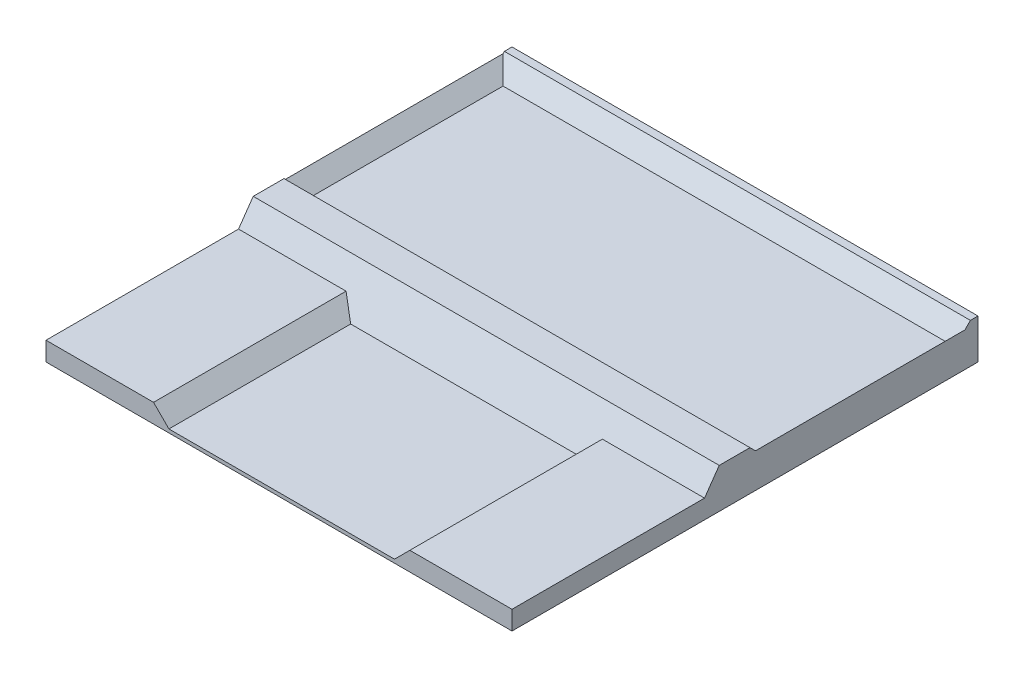
ISO-10303-21;
HEADER;
FILE_DESCRIPTION(('STEP AP214'),'2;1');
FILE_NAME('part.step','',(''),(''),'','','');
FILE_SCHEMA(('AUTOMOTIVE_DESIGN { 1 0 10303 214 1 1 1 1 }'));
ENDSEC;
DATA;
#1=APPLICATION_CONTEXT('core data for automotive mechanical design processes');
#2=APPLICATION_PROTOCOL_DEFINITION('international standard','automotive_design',2000,#1);
#3=PRODUCT_CONTEXT('',#1,'mechanical');
#4=PRODUCT('Part','Part','',(#3));
#5=PRODUCT_RELATED_PRODUCT_CATEGORY('part','',(#4));
#6=PRODUCT_DEFINITION_FORMATION('','',#4);
#7=PRODUCT_DEFINITION_CONTEXT('part definition',#1,'design');
#8=PRODUCT_DEFINITION('design','',#6,#7);
#9=PRODUCT_DEFINITION_SHAPE('','',#8);
#10=(LENGTH_UNIT() NAMED_UNIT(*) SI_UNIT(.MILLI.,.METRE.));
#11=(NAMED_UNIT(*) PLANE_ANGLE_UNIT() SI_UNIT($,.RADIAN.));
#12=(NAMED_UNIT(*) SI_UNIT($,.STERADIAN.) SOLID_ANGLE_UNIT());
#13=UNCERTAINTY_MEASURE_WITH_UNIT(LENGTH_MEASURE(1.E-05),#10,'distance_accuracy_value','');
#14=(GEOMETRIC_REPRESENTATION_CONTEXT(3) GLOBAL_UNCERTAINTY_ASSIGNED_CONTEXT((#13)) GLOBAL_UNIT_ASSIGNED_CONTEXT((#10,
#11,#12)) REPRESENTATION_CONTEXT('',''));
#15=CARTESIAN_POINT('',(0.,0.,0.));
#16=DIRECTION('',(0.,0.,1.));
#17=DIRECTION('',(1.,0.,0.));
#18=AXIS2_PLACEMENT_3D('',#15,#16,#17);
#19=CARTESIAN_POINT('',(90.,0.,0.));
#20=DIRECTION('',(1.,0.,0.));
#21=DIRECTION('',(0.,0.,-1.));
#22=AXIS2_PLACEMENT_3D('',#19,#20,#21);
#23=PLANE('',#22);
#24=DIRECTION('',(0.,0.,1.));
#25=VECTOR('',#24,1.);
#26=CARTESIAN_POINT('',(90.,73.2813818702787,48.078086111532));
#27=LINE('',#26,#25);
#28=CARTESIAN_POINT('',(90.,73.2813818702787,-34.9391813018675));
#29=VERTEX_POINT('',#28);
#30=CARTESIAN_POINT('',(90.,73.2813818702787,45.9553535249315));
#31=VERTEX_POINT('',#30);
#32=EDGE_CURVE('E278',#29,#31,#27,.T.);
#33=ORIENTED_EDGE('',*,*,#32,.T.);
#34=DIRECTION('',(0.,0.707106781186548,0.707106781186548));
#35=VECTOR('',#34,1.);
#36=CARTESIAN_POINT('',(90.,75.4041144568792,48.078086111532));
#37=LINE('',#36,#35);
#38=CARTESIAN_POINT('',(90.,75.4041144568792,48.078086111532));
#39=VERTEX_POINT('',#38);
#40=EDGE_CURVE('E276',#31,#39,#37,.T.);
#41=ORIENTED_EDGE('',*,*,#40,.T.);
#42=DIRECTION('',(0.,0.,1.));
#43=VECTOR('',#42,1.);
#44=CARTESIAN_POINT('',(90.,75.4041144568792,59.958086111532));
#45=LINE('',#44,#43);
#46=CARTESIAN_POINT('',(90.,75.4041144568792,59.958086111532));
#47=VERTEX_POINT('',#46);
#48=EDGE_CURVE('E283',#39,#47,#45,.T.);
#49=ORIENTED_EDGE('',*,*,#48,.T.);
#50=DIRECTION('',(0.,-0.819152044288993,0.573576436351045));
#51=VECTOR('',#50,1.);
#52=CARTESIAN_POINT('',(90.,67.2945092184182,65.6364928314073));
#53=LINE('',#52,#51);
#54=CARTESIAN_POINT('',(90.,67.2945092184182,65.6364928314073));
#55=VERTEX_POINT('',#54);
#56=EDGE_CURVE('E285',#47,#55,#53,.T.);
#57=ORIENTED_EDGE('',*,*,#56,.T.);
#58=DIRECTION('',(0.,0.,1.));
#59=VECTOR('',#58,1.);
#60=CARTESIAN_POINT('',(90.,67.2945092184182,144.836492831407));
#61=LINE('',#60,#59);
#62=CARTESIAN_POINT('',(90.,67.2945092184182,140.));
#63=VERTEX_POINT('',#62);
#64=EDGE_CURVE('E78',#55,#63,#61,.T.);
#65=ORIENTED_EDGE('',*,*,#64,.T.);
#66=DIRECTION('',(0.,1.,0.));
#67=VECTOR('',#66,1.);
#68=CARTESIAN_POINT('',(90.,0.,140.));
#69=LINE('',#68,#67);
#70=CARTESIAN_POINT('',(90.,59.9999999998261,140.));
#71=VERTEX_POINT('',#70);
#72=EDGE_CURVE('E15',#71,#63,#69,.T.);
#73=ORIENTED_EDGE('',*,*,#72,.F.);
#74=DIRECTION('',(0.,0.,-1.));
#75=VECTOR('',#74,1.);
#76=CARTESIAN_POINT('',(90.,60.,0.));
#77=LINE('',#76,#75);
#78=CARTESIAN_POINT('',(90.,60.,-40.));
#79=VERTEX_POINT('',#78);
#80=EDGE_CURVE('E174',#71,#79,#77,.T.);
#81=ORIENTED_EDGE('',*,*,#80,.T.);
#82=DIRECTION('',(0.,1.,0.));
#83=VECTOR('',#82,1.);
#84=CARTESIAN_POINT('',(90.,0.,-40.));
#85=LINE('',#84,#83);
#86=CARTESIAN_POINT('',(90.,75.4041144568792,-40.));
#87=VERTEX_POINT('',#86);
#88=EDGE_CURVE('E287',#79,#87,#85,.T.);
#89=ORIENTED_EDGE('',*,*,#88,.T.);
#90=CARTESIAN_POINT('',(90.,75.4041144568792,-37.061913888468));
#91=VERTEX_POINT('',#90);
#92=EDGE_CURVE('E282',#87,#91,#45,.T.);
#93=ORIENTED_EDGE('',*,*,#92,.T.);
#94=DIRECTION('',(0.,-0.707106781186548,0.707106781186547));
#95=VECTOR('',#94,1.);
#96=CARTESIAN_POINT('',(90.,75.4041144568792,-37.061913888468));
#97=LINE('',#96,#95);
#98=EDGE_CURVE('E280',#91,#29,#97,.T.);
#99=ORIENTED_EDGE('',*,*,#98,.T.);
#100=EDGE_LOOP('',(#33,#41,#49,#57,#65,#73,#81,#89,#93,#99));
#101=FACE_BOUND('',#100,.T.);
#102=ADVANCED_FACE('F63',(#101),#23,.T.);
#103=CARTESIAN_POINT('',(100.042732586601,67.2945092184182,144.836492831407));
#104=DIRECTION('',(0.,-1.,0.));
#105=DIRECTION('',(0.,0.,-1.));
#106=AXIS2_PLACEMENT_3D('',#103,#104,#105);
#107=PLANE('',#106);
#108=ORIENTED_EDGE('',*,*,#64,.F.);
#109=DIRECTION('',(-1.,0.,0.));
#110=VECTOR('',#109,1.);
#111=CARTESIAN_POINT('',(100.042732586601,67.2945092184182,65.6364928314073));
#112=LINE('',#111,#110);
#113=CARTESIAN_POINT('',(50.5427325866005,67.2945092184182,65.6364928314073));
#114=VERTEX_POINT('',#113);
#115=EDGE_CURVE('E225',#55,#114,#112,.T.);
#116=ORIENTED_EDGE('',*,*,#115,.T.);
#117=DIRECTION('',(0.,0.,1.));
#118=VECTOR('',#117,1.);
#119=CARTESIAN_POINT('',(50.5427325866005,67.2945092184182,65.6364928314073));
#120=LINE('',#119,#118);
#121=CARTESIAN_POINT('',(50.5427325866005,67.2945092184182,140.));
#122=VERTEX_POINT('',#121);
#123=EDGE_CURVE('E232',#114,#122,#120,.T.);
#124=ORIENTED_EDGE('',*,*,#123,.T.);
#125=DIRECTION('',(-1.,0.,0.));
#126=VECTOR('',#125,1.);
#127=CARTESIAN_POINT('',(100.042732586601,67.2945092184182,140.));
#128=LINE('',#127,#126);
#129=EDGE_CURVE('E253',#63,#122,#128,.T.);
#130=ORIENTED_EDGE('',*,*,#129,.F.);
#131=EDGE_LOOP('',(#108,#116,#124,#130));
#132=FACE_BOUND('',#131,.T.);
#133=ADVANCED_FACE('F350',(#132),#107,.F.);
#134=CARTESIAN_POINT('',(0.,60.,0.));
#135=DIRECTION('',(0.,1.,0.));
#136=DIRECTION('',(0.,0.,1.));
#137=AXIS2_PLACEMENT_3D('',#134,#135,#136);
#138=PLANE('',#137);
#139=ORIENTED_EDGE('',*,*,#80,.F.);
#140=DIRECTION('',(1.,0.,0.));
#141=VECTOR('',#140,1.);
#142=CARTESIAN_POINT('',(0.,60.,140.));
#143=LINE('',#142,#141);
#144=CARTESIAN_POINT('',(-90.,60.,140.));
#145=VERTEX_POINT('',#144);
#146=EDGE_CURVE('E183',#145,#71,#143,.T.);
#147=ORIENTED_EDGE('',*,*,#146,.F.);
#148=DIRECTION('',(0.,0.,-1.));
#149=VECTOR('',#148,1.);
#150=CARTESIAN_POINT('',(-90.,60.,0.));
#151=LINE('',#150,#149);
#152=CARTESIAN_POINT('',(-90.,60.,-40.));
#153=VERTEX_POINT('',#152);
#154=EDGE_CURVE('E274',#145,#153,#151,.T.);
#155=ORIENTED_EDGE('',*,*,#154,.T.);
#156=DIRECTION('',(1.,0.,0.));
#157=VECTOR('',#156,1.);
#158=CARTESIAN_POINT('',(0.,60.,-40.));
#159=LINE('',#158,#157);
#160=EDGE_CURVE('E186',#153,#79,#159,.T.);
#161=ORIENTED_EDGE('',*,*,#160,.T.);
#162=EDGE_LOOP('',(#139,#147,#155,#161));
#163=FACE_BOUND('',#162,.T.);
#164=ADVANCED_FACE('F182',(#163),#138,.F.);
#165=CARTESIAN_POINT('',(92.1227325866005,75.4041144568792,48.078086111532));
#166=DIRECTION('',(0.,-0.707106781186547,0.707106781186547));
#167=DIRECTION('',(-1.,0.,0.));
#168=AXIS2_PLACEMENT_3D('',#165,#166,#167);
#169=PLANE('',#168);
#170=ORIENTED_EDGE('',*,*,#40,.F.);
#171=DIRECTION('',(-0.577350269189626,-0.577350269189626,-0.577350269189626));
#172=VECTOR('',#171,1.);
#173=CARTESIAN_POINT('',(92.1227325866005,75.4041144568792,48.078086111532));
#174=LINE('',#173,#172);
#175=CARTESIAN_POINT('',(86.1827325866005,69.4641144568792,42.138086111532));
#176=VERTEX_POINT('',#175);
#177=EDGE_CURVE('E197',#31,#176,#174,.T.);
#178=ORIENTED_EDGE('',*,*,#177,.T.);
#179=DIRECTION('',(1.,0.,0.));
#180=VECTOR('',#179,1.);
#181=CARTESIAN_POINT('',(1.04273258660053,69.4641144568792,42.138086111532));
#182=LINE('',#181,#180);
#183=CARTESIAN_POINT('',(-84.5800351928598,69.4641144568792,42.138086111532));
#184=VERTEX_POINT('',#183);
#185=EDGE_CURVE('E207',#184,#176,#182,.T.);
#186=ORIENTED_EDGE('',*,*,#185,.F.);
#187=DIRECTION('',(0.577350269189626,-0.577350269189626,-0.577350269189626));
#188=VECTOR('',#187,1.);
#189=CARTESIAN_POINT('',(-29.6391125997064,14.5231918637258,-12.8028364816214));
#190=LINE('',#189,#188);
#191=CARTESIAN_POINT('',(-90.,74.8840792640194,47.5580509186722));
#192=VERTEX_POINT('',#191);
#193=EDGE_CURVE('E195',#192,#184,#190,.T.);
#194=ORIENTED_EDGE('',*,*,#193,.F.);
#195=DIRECTION('',(0.,0.707106781186548,0.707106781186548));
#196=VECTOR('',#195,1.);
#197=CARTESIAN_POINT('',(-90.,75.4041144568792,48.078086111532));
#198=LINE('',#197,#196);
#199=CARTESIAN_POINT('',(-90.,75.4041144568792,48.078086111532));
#200=VERTEX_POINT('',#199);
#201=EDGE_CURVE('E258',#192,#200,#198,.T.);
#202=ORIENTED_EDGE('',*,*,#201,.T.);
#203=DIRECTION('',(1.,0.,0.));
#204=VECTOR('',#203,1.);
#205=CARTESIAN_POINT('',(92.1227325866005,75.4041144568792,48.078086111532));
#206=LINE('',#205,#204);
#207=EDGE_CURVE('E239',#200,#39,#206,.T.);
#208=ORIENTED_EDGE('',*,*,#207,.T.);
#209=EDGE_LOOP('',(#170,#178,#186,#194,#202,#208));
#210=FACE_BOUND('',#209,.T.);
#211=ADVANCED_FACE('F320',(#210),#169,.F.);
#212=CARTESIAN_POINT('',(92.1227325866005,75.4041144568792,48.078086111532));
#213=DIRECTION('',(0.707106781186548,-0.707106781186547,0.));
#214=DIRECTION('',(0.,0.,1.));
#215=AXIS2_PLACEMENT_3D('',#212,#213,#214);
#216=PLANE('',#215);
#217=ORIENTED_EDGE('',*,*,#32,.F.);
#218=DIRECTION('',(-0.577350269189626,-0.577350269189626,0.577350269189626));
#219=VECTOR('',#218,1.);
#220=CARTESIAN_POINT('',(92.1227325866005,75.4041144568792,-37.061913888468));
#221=LINE('',#220,#219);
#222=CARTESIAN_POINT('',(86.1827325866005,69.4641144568792,-31.121913888468));
#223=VERTEX_POINT('',#222);
#224=EDGE_CURVE('E199',#29,#223,#221,.T.);
#225=ORIENTED_EDGE('',*,*,#224,.T.);
#226=DIRECTION('',(0.,0.,-1.));
#227=VECTOR('',#226,1.);
#228=CARTESIAN_POINT('',(86.1827325866005,69.4641144568792,-54.6203206083434));
#229=LINE('',#228,#227);
#230=EDGE_CURVE('E204',#176,#223,#229,.T.);
#231=ORIENTED_EDGE('',*,*,#230,.F.);
#232=ORIENTED_EDGE('',*,*,#177,.F.);
#233=EDGE_LOOP('',(#217,#225,#231,#232));
#234=FACE_BOUND('',#233,.T.);
#235=ADVANCED_FACE('F315',(#234),#216,.F.);
#236=CARTESIAN_POINT('',(92.1227325866005,75.4041144568792,-37.061913888468));
#237=DIRECTION('',(0.,-0.707106781186547,-0.707106781186548));
#238=DIRECTION('',(1.,0.,0.));
#239=AXIS2_PLACEMENT_3D('',#236,#237,#238);
#240=PLANE('',#239);
#241=ORIENTED_EDGE('',*,*,#98,.F.);
#242=DIRECTION('',(-1.,0.,0.));
#243=VECTOR('',#242,1.);
#244=CARTESIAN_POINT('',(92.1227325866005,75.4041144568792,-37.061913888468));
#245=LINE('',#244,#243);
#246=CARTESIAN_POINT('',(-90.,75.4041144568792,-37.061913888468));
#247=VERTEX_POINT('',#246);
#248=EDGE_CURVE('E235',#91,#247,#245,.T.);
#249=ORIENTED_EDGE('',*,*,#248,.T.);
#250=DIRECTION('',(0.,-0.707106781186548,0.707106781186547));
#251=VECTOR('',#250,1.);
#252=CARTESIAN_POINT('',(-90.,75.4041144568792,-37.061913888468));
#253=LINE('',#252,#251);
#254=CARTESIAN_POINT('',(-90.,74.8840792640194,-36.5418786956082));
#255=VERTEX_POINT('',#254);
#256=EDGE_CURVE('E260',#247,#255,#253,.T.);
#257=ORIENTED_EDGE('',*,*,#256,.T.);
#258=DIRECTION('',(0.577350269189626,-0.577350269189626,0.577350269189625));
#259=VECTOR('',#258,1.);
#260=CARTESIAN_POINT('',(-62.1400351928598,47.0241144568792,-8.68191388846802));
#261=LINE('',#260,#259);
#262=CARTESIAN_POINT('',(-84.5800351928598,69.4641144568792,-31.121913888468));
#263=VERTEX_POINT('',#262);
#264=EDGE_CURVE('E191',#255,#263,#261,.T.);
#265=ORIENTED_EDGE('',*,*,#264,.T.);
#266=DIRECTION('',(-1.,0.,0.));
#267=VECTOR('',#266,1.);
#268=CARTESIAN_POINT('',(1.04273258660052,69.4641144568792,-31.121913888468));
#269=LINE('',#268,#267);
#270=EDGE_CURVE('E201',#223,#263,#269,.T.);
#271=ORIENTED_EDGE('',*,*,#270,.F.);
#272=ORIENTED_EDGE('',*,*,#224,.F.);
#273=EDGE_LOOP('',(#241,#249,#257,#265,#271,#272));
#274=FACE_BOUND('',#273,.T.);
#275=ADVANCED_FACE('F305',(#274),#240,.F.);
#276=CARTESIAN_POINT('',(100.042732586601,75.4041144568792,59.958086111532));
#277=DIRECTION('',(0.,-1.,0.));
#278=DIRECTION('',(0.,0.,-1.));
#279=AXIS2_PLACEMENT_3D('',#276,#277,#278);
#280=PLANE('',#279);
#281=ORIENTED_EDGE('',*,*,#92,.F.);
#282=DIRECTION('',(-1.,0.,0.));
#283=VECTOR('',#282,1.);
#284=CARTESIAN_POINT('',(100.042732586601,75.4041144568792,-40.));
#285=LINE('',#284,#283);
#286=CARTESIAN_POINT('',(-90.,75.4041144568792,-40.));
#287=VERTEX_POINT('',#286);
#288=EDGE_CURVE('E242',#87,#287,#285,.T.);
#289=ORIENTED_EDGE('',*,*,#288,.T.);
#290=DIRECTION('',(0.,0.,1.));
#291=VECTOR('',#290,1.);
#292=CARTESIAN_POINT('',(-90.,75.4041144568792,59.958086111532));
#293=LINE('',#292,#291);
#294=EDGE_CURVE('E262',#287,#247,#293,.T.);
#295=ORIENTED_EDGE('',*,*,#294,.T.);
#296=ORIENTED_EDGE('',*,*,#248,.F.);
#297=EDGE_LOOP('',(#281,#289,#295,#296));
#298=FACE_BOUND('',#297,.T.);
#299=ADVANCED_FACE('F295',(#298),#280,.F.);
#300=ORIENTED_EDGE('',*,*,#48,.F.);
#301=ORIENTED_EDGE('',*,*,#207,.F.);
#302=CARTESIAN_POINT('',(-90.,75.4041144568792,59.958086111532));
#303=VERTEX_POINT('',#302);
#304=EDGE_CURVE('E263',#200,#303,#293,.T.);
#305=ORIENTED_EDGE('',*,*,#304,.T.);
#306=DIRECTION('',(-1.,0.,0.));
#307=VECTOR('',#306,1.);
#308=CARTESIAN_POINT('',(100.042732586601,75.4041144568792,59.958086111532));
#309=LINE('',#308,#307);
#310=EDGE_CURVE('E223',#47,#303,#309,.T.);
#311=ORIENTED_EDGE('',*,*,#310,.F.);
#312=EDGE_LOOP('',(#300,#301,#305,#311));
#313=FACE_BOUND('',#312,.T.);
#314=ADVANCED_FACE('F324',(#313),#280,.F.);
#315=CARTESIAN_POINT('',(100.042732586601,67.2945092184182,65.6364928314073));
#316=DIRECTION('',(0.,-0.573576436351045,-0.819152044288993));
#317=DIRECTION('',(0.,0.819152044288993,-0.573576436351045));
#318=AXIS2_PLACEMENT_3D('',#315,#316,#317);
#319=PLANE('',#318);
#320=ORIENTED_EDGE('',*,*,#56,.F.);
#321=ORIENTED_EDGE('',*,*,#310,.T.);
#322=DIRECTION('',(0.,-0.819152044288993,0.573576436351045));
#323=VECTOR('',#322,1.);
#324=CARTESIAN_POINT('',(-90.,67.2945092184182,65.6364928314073));
#325=LINE('',#324,#323);
#326=CARTESIAN_POINT('',(-90.,67.2945092184182,65.6364928314073));
#327=VERTEX_POINT('',#326);
#328=EDGE_CURVE('E266',#303,#327,#325,.T.);
#329=ORIENTED_EDGE('',*,*,#328,.T.);
#330=CARTESIAN_POINT('',(-48.4572674133995,67.2945092184182,65.6364928314073));
#331=VERTEX_POINT('',#330);
#332=EDGE_CURVE('E227',#331,#327,#112,.T.);
#333=ORIENTED_EDGE('',*,*,#332,.F.);
#334=DIRECTION('',(-0.633687274224642,0.633687274224643,-0.443712606279657));
#335=VECTOR('',#334,1.);
#336=CARTESIAN_POINT('',(-82.2704807820387,101.107722587057,41.9602259395928));
#337=LINE('',#336,#335);
#338=CARTESIAN_POINT('',(-42.5172674133995,61.3545092184182,69.795725608373));
#339=VERTEX_POINT('',#338);
#340=EDGE_CURVE('E218',#331,#339,#337,.F.);
#341=ORIENTED_EDGE('',*,*,#340,.T.);
#342=DIRECTION('',(1.,0.,0.));
#343=VECTOR('',#342,1.);
#344=CARTESIAN_POINT('',(-48.4572674133995,61.3545092184182,69.795725608373));
#345=LINE('',#344,#343);
#346=CARTESIAN_POINT('',(44.6027325866005,61.3545092184182,69.795725608373));
#347=VERTEX_POINT('',#346);
#348=EDGE_CURVE('E228',#339,#347,#345,.T.);
#349=ORIENTED_EDGE('',*,*,#348,.T.);
#350=DIRECTION('',(0.633687274224642,0.633687274224643,-0.443712606279657));
#351=VECTOR('',#350,1.);
#352=CARTESIAN_POINT('',(84.3559459552398,101.107722587058,41.9602259395928));
#353=LINE('',#352,#351);
#354=EDGE_CURVE('E213',#347,#114,#353,.T.);
#355=ORIENTED_EDGE('',*,*,#354,.T.);
#356=ORIENTED_EDGE('',*,*,#115,.F.);
#357=EDGE_LOOP('',(#320,#321,#329,#333,#341,#349,#355,#356));
#358=FACE_BOUND('',#357,.T.);
#359=ADVANCED_FACE('F332',(#358),#319,.F.);
#360=CARTESIAN_POINT('',(0.,0.,-40.));
#361=DIRECTION('',(0.,0.,1.));
#362=DIRECTION('',(1.,0.,0.));
#363=AXIS2_PLACEMENT_3D('',#360,#361,#362);
#364=PLANE('',#363);
#365=ORIENTED_EDGE('',*,*,#88,.F.);
#366=ORIENTED_EDGE('',*,*,#160,.F.);
#367=DIRECTION('',(0.,1.,0.));
#368=VECTOR('',#367,1.);
#369=CARTESIAN_POINT('',(-90.,0.,-40.));
#370=LINE('',#369,#368);
#371=EDGE_CURVE('E268',#153,#287,#370,.T.);
#372=ORIENTED_EDGE('',*,*,#371,.T.);
#373=ORIENTED_EDGE('',*,*,#288,.F.);
#374=EDGE_LOOP('',(#365,#366,#372,#373));
#375=FACE_BOUND('',#374,.T.);
#376=ADVANCED_FACE('F297',(#375),#364,.F.);
#377=CARTESIAN_POINT('',(0.,0.,140.));
#378=DIRECTION('',(0.,0.,1.));
#379=DIRECTION('',(1.,0.,0.));
#380=AXIS2_PLACEMENT_3D('',#377,#378,#379);
#381=PLANE('',#380);
#382=ORIENTED_EDGE('',*,*,#146,.T.);
#383=ORIENTED_EDGE('',*,*,#72,.T.);
#384=ORIENTED_EDGE('',*,*,#129,.T.);
#385=DIRECTION('',(-0.707106781186547,-0.707106781186548,0.));
#386=VECTOR('',#385,1.);
#387=CARTESIAN_POINT('',(50.5427325866005,67.2945092184182,140.));
#388=LINE('',#387,#386);
#389=CARTESIAN_POINT('',(44.6027325866005,61.3545092184182,140.));
#390=VERTEX_POINT('',#389);
#391=EDGE_CURVE('E247',#122,#390,#388,.T.);
#392=ORIENTED_EDGE('',*,*,#391,.T.);
#393=DIRECTION('',(-1.,0.,0.));
#394=VECTOR('',#393,1.);
#395=CARTESIAN_POINT('',(-48.4572674133995,61.3545092184182,140.));
#396=LINE('',#395,#394);
#397=CARTESIAN_POINT('',(-42.5172674133995,61.3545092184182,140.));
#398=VERTEX_POINT('',#397);
#399=EDGE_CURVE('E244',#390,#398,#396,.T.);
#400=ORIENTED_EDGE('',*,*,#399,.T.);
#401=DIRECTION('',(0.707106781186547,-0.707106781186548,0.));
#402=VECTOR('',#401,1.);
#403=CARTESIAN_POINT('',(-48.4572674133995,67.2945092184182,140.));
#404=LINE('',#403,#402);
#405=CARTESIAN_POINT('',(-48.4572674133995,67.2945092184182,140.));
#406=VERTEX_POINT('',#405);
#407=EDGE_CURVE('E250',#398,#406,#404,.F.);
#408=ORIENTED_EDGE('',*,*,#407,.T.);
#409=DIRECTION('',(-1.,0.,0.));
#410=VECTOR('',#409,1.);
#411=CARTESIAN_POINT('',(100.042732586601,67.2945092184182,140.));
#412=LINE('',#411,#410);
#413=CARTESIAN_POINT('',(-90.,67.2945092184182,140.));
#414=VERTEX_POINT('',#413);
#415=EDGE_CURVE('E255',#406,#414,#412,.T.);
#416=ORIENTED_EDGE('',*,*,#415,.T.);
#417=DIRECTION('',(0.,1.,0.));
#418=VECTOR('',#417,1.);
#419=CARTESIAN_POINT('',(-90.,0.,140.));
#420=LINE('',#419,#418);
#421=EDGE_CURVE('E71',#145,#414,#420,.T.);
#422=ORIENTED_EDGE('',*,*,#421,.F.);
#423=EDGE_LOOP('',(#382,#383,#384,#392,#400,#408,#416,#422));
#424=FACE_BOUND('',#423,.T.);
#425=ADVANCED_FACE('F188',(#424),#381,.T.);
#426=CARTESIAN_POINT('',(-90.,0.,0.));
#427=DIRECTION('',(1.,0.,0.));
#428=DIRECTION('',(0.,0.,-1.));
#429=AXIS2_PLACEMENT_3D('',#426,#427,#428);
#430=PLANE('',#429);
#431=DIRECTION('',(0.,0.,1.));
#432=VECTOR('',#431,1.);
#433=CARTESIAN_POINT('',(-90.,74.8840792640194,48.078086111532));
#434=LINE('',#433,#432);
#435=EDGE_CURVE('E85',#255,#192,#434,.T.);
#436=ORIENTED_EDGE('',*,*,#435,.F.);
#437=ORIENTED_EDGE('',*,*,#256,.F.);
#438=ORIENTED_EDGE('',*,*,#294,.F.);
#439=ORIENTED_EDGE('',*,*,#371,.F.);
#440=ORIENTED_EDGE('',*,*,#154,.F.);
#441=ORIENTED_EDGE('',*,*,#421,.T.);
#442=DIRECTION('',(0.,0.,1.));
#443=VECTOR('',#442,1.);
#444=CARTESIAN_POINT('',(-90.,67.2945092184182,144.836492831407));
#445=LINE('',#444,#443);
#446=EDGE_CURVE('E271',#327,#414,#445,.T.);
#447=ORIENTED_EDGE('',*,*,#446,.F.);
#448=ORIENTED_EDGE('',*,*,#328,.F.);
#449=ORIENTED_EDGE('',*,*,#304,.F.);
#450=ORIENTED_EDGE('',*,*,#201,.F.);
#451=EDGE_LOOP('',(#436,#437,#438,#439,#440,#441,#447,#448,#449,#450));
#452=FACE_BOUND('',#451,.T.);
#453=ADVANCED_FACE('F302',(#452),#430,.F.);
#454=CARTESIAN_POINT('',(50.5427325866005,67.2945092184182,-54.6203206083434));
#455=DIRECTION('',(0.707106781186548,-0.707106781186547,0.));
#456=DIRECTION('',(0.,0.,1.));
#457=AXIS2_PLACEMENT_3D('',#454,#455,#456);
#458=PLANE('',#457);
#459=ORIENTED_EDGE('',*,*,#391,.F.);
#460=ORIENTED_EDGE('',*,*,#123,.F.);
#461=ORIENTED_EDGE('',*,*,#354,.F.);
#462=DIRECTION('',(0.,0.,-1.));
#463=VECTOR('',#462,1.);
#464=CARTESIAN_POINT('',(44.6027325866005,61.3545092184182,141.9007446406));
#465=LINE('',#464,#463);
#466=EDGE_CURVE('E216',#390,#347,#465,.T.);
#467=ORIENTED_EDGE('',*,*,#466,.F.);
#468=EDGE_LOOP('',(#459,#460,#461,#467));
#469=FACE_BOUND('',#468,.T.);
#470=ADVANCED_FACE('F346',(#469),#458,.F.);
#471=CARTESIAN_POINT('',(-48.4572674133995,67.2945092184182,-54.6203206083434));
#472=DIRECTION('',(0.707106781186548,0.707106781186547,0.));
#473=DIRECTION('',(0.,0.,1.));
#474=AXIS2_PLACEMENT_3D('',#471,#472,#473);
#475=PLANE('',#474);
#476=ORIENTED_EDGE('',*,*,#407,.F.);
#477=DIRECTION('',(0.,0.,1.));
#478=VECTOR('',#477,1.);
#479=CARTESIAN_POINT('',(-42.5172674133995,61.3545092184182,144.670612130041));
#480=LINE('',#479,#478);
#481=EDGE_CURVE('E220',#339,#398,#480,.T.);
#482=ORIENTED_EDGE('',*,*,#481,.F.);
#483=ORIENTED_EDGE('',*,*,#340,.F.);
#484=DIRECTION('',(0.,0.,1.));
#485=VECTOR('',#484,1.);
#486=CARTESIAN_POINT('',(-48.4572674133995,67.2945092184182,65.6364928314073));
#487=LINE('',#486,#485);
#488=EDGE_CURVE('E231',#331,#406,#487,.T.);
#489=ORIENTED_EDGE('',*,*,#488,.T.);
#490=EDGE_LOOP('',(#476,#482,#483,#489));
#491=FACE_BOUND('',#490,.T.);
#492=ADVANCED_FACE('F337',(#491),#475,.T.);
#493=ORIENTED_EDGE('',*,*,#332,.T.);
#494=ORIENTED_EDGE('',*,*,#446,.T.);
#495=ORIENTED_EDGE('',*,*,#415,.F.);
#496=ORIENTED_EDGE('',*,*,#488,.F.);
#497=EDGE_LOOP('',(#493,#494,#495,#496));
#498=FACE_BOUND('',#497,.T.);
#499=ADVANCED_FACE('F335',(#498),#107,.F.);
#500=CARTESIAN_POINT('',(-48.4572674133995,61.3545092184182,141.9007446406));
#501=DIRECTION('',(0.,-1.,0.));
#502=DIRECTION('',(0.,0.,-1.));
#503=AXIS2_PLACEMENT_3D('',#500,#501,#502);
#504=PLANE('',#503);
#505=ORIENTED_EDGE('',*,*,#399,.F.);
#506=ORIENTED_EDGE('',*,*,#466,.T.);
#507=ORIENTED_EDGE('',*,*,#348,.F.);
#508=ORIENTED_EDGE('',*,*,#481,.T.);
#509=EDGE_LOOP('',(#505,#506,#507,#508));
#510=FACE_BOUND('',#509,.T.);
#511=ADVANCED_FACE('F342',(#510),#504,.F.);
#512=CARTESIAN_POINT('',(-90.5200351928598,75.4041144568792,48.078086111532));
#513=DIRECTION('',(-0.707106781186548,-0.707106781186547,0.));
#514=DIRECTION('',(0.,0.,-1.));
#515=AXIS2_PLACEMENT_3D('',#512,#513,#514);
#516=PLANE('',#515);
#517=ORIENTED_EDGE('',*,*,#264,.F.);
#518=ORIENTED_EDGE('',*,*,#435,.T.);
#519=ORIENTED_EDGE('',*,*,#193,.T.);
#520=DIRECTION('',(0.,0.,1.));
#521=VECTOR('',#520,1.);
#522=CARTESIAN_POINT('',(-84.5800351928598,69.4641144568792,-54.6203206083434));
#523=LINE('',#522,#521);
#524=EDGE_CURVE('E210',#263,#184,#523,.T.);
#525=ORIENTED_EDGE('',*,*,#524,.F.);
#526=EDGE_LOOP('',(#517,#518,#519,#525));
#527=FACE_BOUND('',#526,.T.);
#528=ADVANCED_FACE('F65',(#527),#516,.F.);
#529=CARTESIAN_POINT('',(1.04273258660052,69.4641144568792,-54.6203206083434));
#530=DIRECTION('',(0.,1.,0.));
#531=DIRECTION('',(0.,0.,1.));
#532=AXIS2_PLACEMENT_3D('',#529,#530,#531);
#533=PLANE('',#532);
#534=ORIENTED_EDGE('',*,*,#230,.T.);
#535=ORIENTED_EDGE('',*,*,#270,.T.);
#536=ORIENTED_EDGE('',*,*,#524,.T.);
#537=ORIENTED_EDGE('',*,*,#185,.T.);
#538=EDGE_LOOP('',(#534,#535,#536,#537));
#539=FACE_BOUND('',#538,.T.);
#540=ADVANCED_FACE('F310',(#539),#533,.T.);
#541=CLOSED_SHELL('',(#102,#133,#164,#211,#235,#275,#299,#314,#359,#376,#425,#453,#470,#492,
#499,#511,#528,#540));
#542=MANIFOLD_SOLID_BREP('B2',#541);
#543=ADVANCED_BREP_SHAPE_REPRESENTATION('',(#18,#542),#14);
#544=SHAPE_DEFINITION_REPRESENTATION(#9,#543);
ENDSEC;
END-ISO-10303-21;
